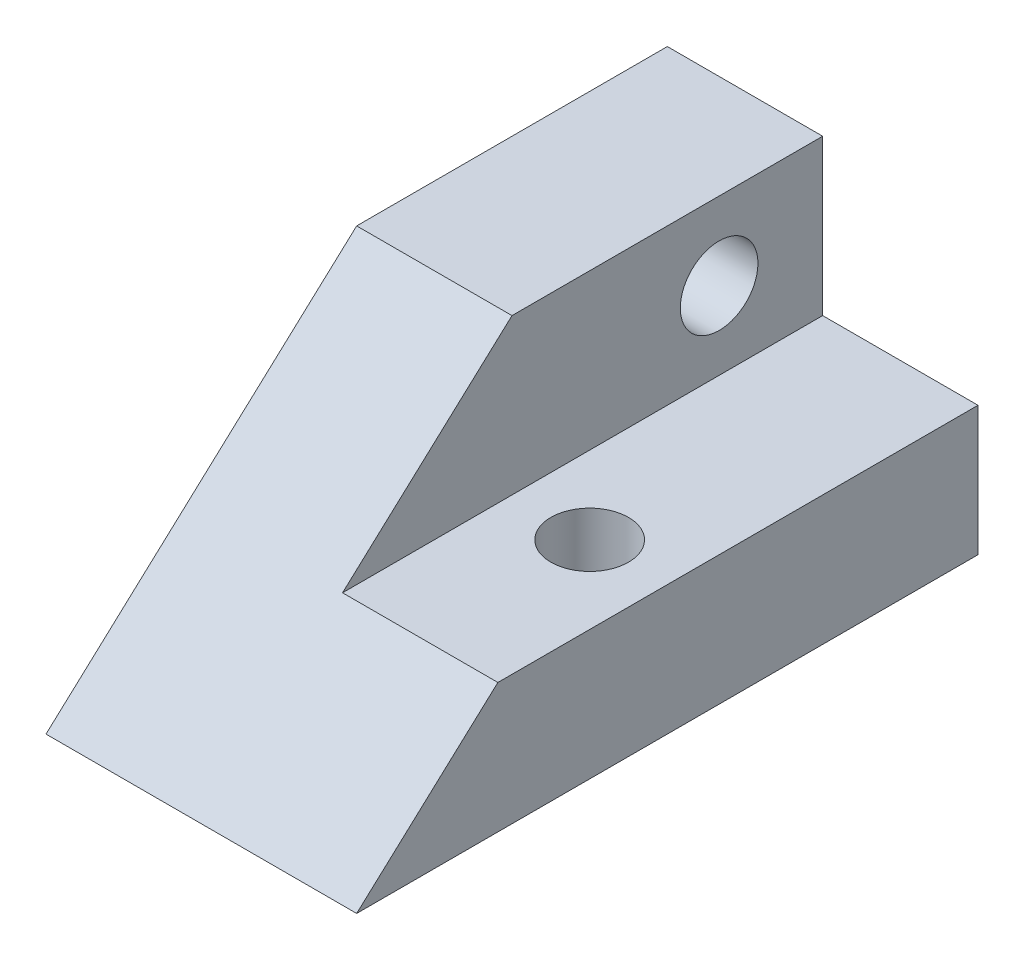
ISO-10303-21;
HEADER;
FILE_DESCRIPTION(('STEP AP214'),'2;1');
FILE_NAME('part.step','',(''),(''),'','','');
FILE_SCHEMA(('AUTOMOTIVE_DESIGN { 1 0 10303 214 1 1 1 1 }'));
ENDSEC;
DATA;
#1=APPLICATION_CONTEXT('core data for automotive mechanical design processes');
#2=APPLICATION_PROTOCOL_DEFINITION('international standard','automotive_design',2000,#1);
#3=PRODUCT_CONTEXT('',#1,'mechanical');
#4=PRODUCT('Part','Part','',(#3));
#5=PRODUCT_RELATED_PRODUCT_CATEGORY('part','',(#4));
#6=PRODUCT_DEFINITION_FORMATION('','',#4);
#7=PRODUCT_DEFINITION_CONTEXT('part definition',#1,'design');
#8=PRODUCT_DEFINITION('design','',#6,#7);
#9=PRODUCT_DEFINITION_SHAPE('','',#8);
#10=(LENGTH_UNIT() NAMED_UNIT(*) SI_UNIT(.MILLI.,.METRE.));
#11=(NAMED_UNIT(*) PLANE_ANGLE_UNIT() SI_UNIT($,.RADIAN.));
#12=(NAMED_UNIT(*) SI_UNIT($,.STERADIAN.) SOLID_ANGLE_UNIT());
#13=UNCERTAINTY_MEASURE_WITH_UNIT(LENGTH_MEASURE(1.E-05),#10,'distance_accuracy_value','');
#14=(GEOMETRIC_REPRESENTATION_CONTEXT(3) GLOBAL_UNCERTAINTY_ASSIGNED_CONTEXT((#13)) GLOBAL_UNIT_ASSIGNED_CONTEXT((#10,
#11,#12)) REPRESENTATION_CONTEXT('',''));
#15=CARTESIAN_POINT('',(0.,0.,0.));
#16=DIRECTION('',(0.,0.,1.));
#17=DIRECTION('',(1.,0.,0.));
#18=AXIS2_PLACEMENT_3D('',#15,#16,#17);
#19=CARTESIAN_POINT('',(-30.,55.,-120.));
#20=DIRECTION('',(0.,0.,1.));
#21=DIRECTION('',(1.,0.,0.));
#22=AXIS2_PLACEMENT_3D('',#19,#20,#21);
#23=PLANE('',#22);
#24=DIRECTION('',(0.,-1.,0.));
#25=VECTOR('',#24,1.);
#26=CARTESIAN_POINT('',(0.,55.,-120.));
#27=LINE('',#26,#25);
#28=CARTESIAN_POINT('',(0.,55.,-120.));
#29=VERTEX_POINT('',#28);
#30=CARTESIAN_POINT('',(0.,25.,-120.));
#31=VERTEX_POINT('',#30);
#32=EDGE_CURVE('E135',#29,#31,#27,.T.);
#33=ORIENTED_EDGE('',*,*,#32,.T.);
#34=DIRECTION('',(-1.,0.,0.));
#35=VECTOR('',#34,1.);
#36=CARTESIAN_POINT('',(30.,25.,-120.));
#37=LINE('',#36,#35);
#38=CARTESIAN_POINT('',(30.,25.,-120.));
#39=VERTEX_POINT('',#38);
#40=EDGE_CURVE('E86',#39,#31,#37,.T.);
#41=ORIENTED_EDGE('',*,*,#40,.F.);
#42=DIRECTION('',(0.,-1.,0.));
#43=VECTOR('',#42,1.);
#44=CARTESIAN_POINT('',(30.,55.,-120.));
#45=LINE('',#44,#43);
#46=CARTESIAN_POINT('',(30.,0.,-120.));
#47=VERTEX_POINT('',#46);
#48=EDGE_CURVE('E79',#39,#47,#45,.T.);
#49=ORIENTED_EDGE('',*,*,#48,.T.);
#50=DIRECTION('',(-1.,0.,0.));
#51=VECTOR('',#50,1.);
#52=CARTESIAN_POINT('',(-30.,0.,-120.));
#53=LINE('',#52,#51);
#54=CARTESIAN_POINT('',(-30.,0.,-120.));
#55=VERTEX_POINT('',#54);
#56=EDGE_CURVE('E83',#47,#55,#53,.T.);
#57=ORIENTED_EDGE('',*,*,#56,.T.);
#58=DIRECTION('',(0.,-1.,0.));
#59=VECTOR('',#58,1.);
#60=CARTESIAN_POINT('',(-30.,55.,-120.));
#61=LINE('',#60,#59);
#62=CARTESIAN_POINT('',(-30.,55.,-120.));
#63=VERTEX_POINT('',#62);
#64=EDGE_CURVE('E90',#63,#55,#61,.T.);
#65=ORIENTED_EDGE('',*,*,#64,.F.);
#66=DIRECTION('',(-1.,0.,0.));
#67=VECTOR('',#66,1.);
#68=CARTESIAN_POINT('',(-30.,55.,-120.));
#69=LINE('',#68,#67);
#70=EDGE_CURVE('E63',#29,#63,#69,.T.);
#71=ORIENTED_EDGE('',*,*,#70,.F.);
#72=EDGE_LOOP('',(#33,#41,#49,#57,#65,#71));
#73=FACE_BOUND('',#72,.T.);
#74=ADVANCED_FACE('F39',(#73),#23,.F.);
#75=CARTESIAN_POINT('',(0.,55.,0.));
#76=DIRECTION('',(0.,1.,0.));
#77=DIRECTION('',(0.,0.,1.));
#78=AXIS2_PLACEMENT_3D('',#75,#76,#77);
#79=PLANE('',#78);
#80=DIRECTION('',(1.,0.,0.));
#81=VECTOR('',#80,1.);
#82=CARTESIAN_POINT('',(-30.,55.,-60.));
#83=LINE('',#82,#81);
#84=CARTESIAN_POINT('',(-30.,55.,-60.));
#85=VERTEX_POINT('',#84);
#86=CARTESIAN_POINT('',(0.,55.,-60.));
#87=VERTEX_POINT('',#86);
#88=EDGE_CURVE('E145',#85,#87,#83,.T.);
#89=ORIENTED_EDGE('',*,*,#88,.T.);
#90=DIRECTION('',(0.,0.,-1.));
#91=VECTOR('',#90,1.);
#92=CARTESIAN_POINT('',(0.,55.,0.));
#93=LINE('',#92,#91);
#94=EDGE_CURVE('E133',#87,#29,#93,.T.);
#95=ORIENTED_EDGE('',*,*,#94,.T.);
#96=ORIENTED_EDGE('',*,*,#70,.T.);
#97=DIRECTION('',(0.,0.,1.));
#98=VECTOR('',#97,1.);
#99=CARTESIAN_POINT('',(-30.,55.,-120.));
#100=LINE('',#99,#98);
#101=EDGE_CURVE('E108',#63,#85,#100,.T.);
#102=ORIENTED_EDGE('',*,*,#101,.T.);
#103=EDGE_LOOP('',(#89,#95,#96,#102));
#104=FACE_BOUND('',#103,.T.);
#105=ADVANCED_FACE('F165',(#104),#79,.T.);
#106=CARTESIAN_POINT('',(-30.,0.,0.));
#107=DIRECTION('',(0.,-0.737154140200741,-0.675724628517346));
#108=DIRECTION('',(0.,0.675724628517346,-0.737154140200741));
#109=AXIS2_PLACEMENT_3D('',#106,#107,#108);
#110=PLANE('',#109);
#111=DIRECTION('',(0.,-0.675724628517346,0.737154140200741));
#112=VECTOR('',#111,1.);
#113=CARTESIAN_POINT('',(0.,0.,0.));
#114=LINE('',#113,#112);
#115=CARTESIAN_POINT('',(0.,25.,-27.2727272727273));
#116=VERTEX_POINT('',#115);
#117=EDGE_CURVE('E11',#87,#116,#114,.T.);
#118=ORIENTED_EDGE('',*,*,#117,.F.);
#119=ORIENTED_EDGE('',*,*,#88,.F.);
#120=DIRECTION('',(0.,0.675724628517346,-0.737154140200741));
#121=VECTOR('',#120,1.);
#122=CARTESIAN_POINT('',(-30.,0.,0.));
#123=LINE('',#122,#121);
#124=CARTESIAN_POINT('',(-30.,0.,0.));
#125=VERTEX_POINT('',#124);
#126=EDGE_CURVE('E141',#125,#85,#123,.T.);
#127=ORIENTED_EDGE('',*,*,#126,.F.);
#128=DIRECTION('',(1.,0.,0.));
#129=VECTOR('',#128,1.);
#130=CARTESIAN_POINT('',(-30.,0.,0.));
#131=LINE('',#130,#129);
#132=CARTESIAN_POINT('',(30.,0.,0.));
#133=VERTEX_POINT('',#132);
#134=EDGE_CURVE('E101',#125,#133,#131,.T.);
#135=ORIENTED_EDGE('',*,*,#134,.T.);
#136=DIRECTION('',(0.,0.675724628517346,-0.737154140200741));
#137=VECTOR('',#136,1.);
#138=CARTESIAN_POINT('',(30.,0.,0.));
#139=LINE('',#138,#137);
#140=CARTESIAN_POINT('',(30.,25.,-27.2727272727273));
#141=VERTEX_POINT('',#140);
#142=EDGE_CURVE('E97',#133,#141,#139,.T.);
#143=ORIENTED_EDGE('',*,*,#142,.T.);
#144=DIRECTION('',(-1.,0.,0.));
#145=VECTOR('',#144,1.);
#146=CARTESIAN_POINT('',(-30.,25.,-27.2727272727273));
#147=LINE('',#146,#145);
#148=EDGE_CURVE('E48',#141,#116,#147,.T.);
#149=ORIENTED_EDGE('',*,*,#148,.T.);
#150=EDGE_LOOP('',(#118,#119,#127,#135,#143,#149));
#151=FACE_BOUND('',#150,.T.);
#152=ADVANCED_FACE('F119',(#151),#110,.F.);
#153=CARTESIAN_POINT('',(-30.,55.,-120.));
#154=DIRECTION('',(1.,0.,0.));
#155=DIRECTION('',(0.,0.,-1.));
#156=AXIS2_PLACEMENT_3D('',#153,#154,#155);
#157=PLANE('',#156);
#158=CARTESIAN_POINT('',(-30.,40.,-100.));
#159=DIRECTION('',(1.,0.,0.));
#160=DIRECTION('',(0.,0.,-1.));
#161=AXIS2_PLACEMENT_3D('',#158,#159,#160);
#162=CIRCLE('',#161,7.50000000000001);
#163=CARTESIAN_POINT('',(-30.,40.,-107.5));
#164=VERTEX_POINT('',#163);
#165=EDGE_CURVE('E197',#164,#164,#162,.T.);
#166=ORIENTED_EDGE('',*,*,#165,.T.);
#167=EDGE_LOOP('',(#166));
#168=FACE_BOUND('',#167,.T.);
#169=DIRECTION('',(0.,0.,1.));
#170=VECTOR('',#169,1.);
#171=CARTESIAN_POINT('',(-30.,0.,-120.));
#172=LINE('',#171,#170);
#173=EDGE_CURVE('E106',#55,#125,#172,.T.);
#174=ORIENTED_EDGE('',*,*,#173,.T.);
#175=ORIENTED_EDGE('',*,*,#126,.T.);
#176=ORIENTED_EDGE('',*,*,#101,.F.);
#177=ORIENTED_EDGE('',*,*,#64,.T.);
#178=EDGE_LOOP('',(#174,#175,#176,#177));
#179=FACE_BOUND('',#178,.T.);
#180=ADVANCED_FACE('F41',(#168,#179),#157,.F.);
#181=CARTESIAN_POINT('',(30.,55.,-120.));
#182=DIRECTION('',(-1.,0.,0.));
#183=DIRECTION('',(0.,0.,1.));
#184=AXIS2_PLACEMENT_3D('',#181,#182,#183);
#185=PLANE('',#184);
#186=ORIENTED_EDGE('',*,*,#48,.F.);
#187=DIRECTION('',(0.,0.,-1.));
#188=VECTOR('',#187,1.);
#189=CARTESIAN_POINT('',(30.,25.,0.));
#190=LINE('',#189,#188);
#191=EDGE_CURVE('E127',#141,#39,#190,.T.);
#192=ORIENTED_EDGE('',*,*,#191,.F.);
#193=ORIENTED_EDGE('',*,*,#142,.F.);
#194=DIRECTION('',(0.,0.,-1.));
#195=VECTOR('',#194,1.);
#196=CARTESIAN_POINT('',(30.,0.,-120.));
#197=LINE('',#196,#195);
#198=EDGE_CURVE('E94',#133,#47,#197,.T.);
#199=ORIENTED_EDGE('',*,*,#198,.T.);
#200=EDGE_LOOP('',(#186,#192,#193,#199));
#201=FACE_BOUND('',#200,.T.);
#202=ADVANCED_FACE('F95',(#201),#185,.F.);
#203=CARTESIAN_POINT('',(0.,0.,0.));
#204=DIRECTION('',(0.,1.,0.));
#205=DIRECTION('',(0.,0.,1.));
#206=AXIS2_PLACEMENT_3D('',#203,#204,#205);
#207=PLANE('',#206);
#208=CARTESIAN_POINT('',(15.,0.,-60.));
#209=DIRECTION('',(0.,1.,0.));
#210=DIRECTION('',(0.,0.,1.));
#211=AXIS2_PLACEMENT_3D('',#208,#209,#210);
#212=CIRCLE('',#211,7.5);
#213=CARTESIAN_POINT('',(15.,0.,-52.5));
#214=VERTEX_POINT('',#213);
#215=EDGE_CURVE('E205',#214,#214,#212,.T.);
#216=ORIENTED_EDGE('',*,*,#215,.T.);
#217=EDGE_LOOP('',(#216));
#218=FACE_BOUND('',#217,.T.);
#219=ORIENTED_EDGE('',*,*,#173,.F.);
#220=ORIENTED_EDGE('',*,*,#56,.F.);
#221=ORIENTED_EDGE('',*,*,#198,.F.);
#222=ORIENTED_EDGE('',*,*,#134,.F.);
#223=EDGE_LOOP('',(#219,#220,#221,#222));
#224=FACE_BOUND('',#223,.T.);
#225=ADVANCED_FACE('F104',(#218,#224),#207,.F.);
#226=CARTESIAN_POINT('',(0.,55.,0.));
#227=DIRECTION('',(1.,0.,0.));
#228=DIRECTION('',(0.,0.,-1.));
#229=AXIS2_PLACEMENT_3D('',#226,#227,#228);
#230=PLANE('',#229);
#231=CARTESIAN_POINT('',(0.,40.,-100.));
#232=DIRECTION('',(1.,0.,0.));
#233=DIRECTION('',(0.,0.,-1.));
#234=AXIS2_PLACEMENT_3D('',#231,#232,#233);
#235=CIRCLE('',#234,7.50000000000001);
#236=CARTESIAN_POINT('',(0.,40.,-107.5));
#237=VERTEX_POINT('',#236);
#238=EDGE_CURVE('E200',#237,#237,#235,.T.);
#239=ORIENTED_EDGE('',*,*,#238,.F.);
#240=EDGE_LOOP('',(#239));
#241=FACE_BOUND('',#240,.T.);
#242=ORIENTED_EDGE('',*,*,#117,.T.);
#243=DIRECTION('',(0.,0.,-1.));
#244=VECTOR('',#243,1.);
#245=CARTESIAN_POINT('',(0.,25.,0.));
#246=LINE('',#245,#244);
#247=EDGE_CURVE('E55',#116,#31,#246,.T.);
#248=ORIENTED_EDGE('',*,*,#247,.T.);
#249=ORIENTED_EDGE('',*,*,#32,.F.);
#250=ORIENTED_EDGE('',*,*,#94,.F.);
#251=EDGE_LOOP('',(#242,#248,#249,#250));
#252=FACE_BOUND('',#251,.T.);
#253=ADVANCED_FACE('F166',(#241,#252),#230,.T.);
#254=CARTESIAN_POINT('',(30.,25.,0.));
#255=DIRECTION('',(0.,-1.,0.));
#256=DIRECTION('',(0.,0.,-1.));
#257=AXIS2_PLACEMENT_3D('',#254,#255,#256);
#258=PLANE('',#257);
#259=CARTESIAN_POINT('',(15.,25.,-60.));
#260=DIRECTION('',(0.,1.,0.));
#261=DIRECTION('',(0.,0.,1.));
#262=AXIS2_PLACEMENT_3D('',#259,#260,#261);
#263=CIRCLE('',#262,7.5);
#264=CARTESIAN_POINT('',(15.,25.,-52.5));
#265=VERTEX_POINT('',#264);
#266=EDGE_CURVE('E208',#265,#265,#263,.T.);
#267=ORIENTED_EDGE('',*,*,#266,.F.);
#268=EDGE_LOOP('',(#267));
#269=FACE_BOUND('',#268,.T.);
#270=ORIENTED_EDGE('',*,*,#191,.T.);
#271=ORIENTED_EDGE('',*,*,#40,.T.);
#272=ORIENTED_EDGE('',*,*,#247,.F.);
#273=ORIENTED_EDGE('',*,*,#148,.F.);
#274=EDGE_LOOP('',(#270,#271,#272,#273));
#275=FACE_BOUND('',#274,.T.);
#276=ADVANCED_FACE('F126',(#269,#275),#258,.F.);
#277=CARTESIAN_POINT('',(-30.,40.,-100.));
#278=DIRECTION('',(1.,0.,0.));
#279=DIRECTION('',(0.,0.,-1.));
#280=AXIS2_PLACEMENT_3D('',#277,#278,#279);
#281=CYLINDRICAL_SURFACE('',#280,7.50000000000001);
#282=ORIENTED_EDGE('',*,*,#165,.F.);
#283=EDGE_LOOP('',(#282));
#284=FACE_BOUND('',#283,.T.);
#285=ORIENTED_EDGE('',*,*,#238,.T.);
#286=EDGE_LOOP('',(#285));
#287=FACE_BOUND('',#286,.T.);
#288=ADVANCED_FACE('F174',(#284,#287),#281,.F.);
#289=CARTESIAN_POINT('',(15.,0.,-60.));
#290=DIRECTION('',(0.,1.,0.));
#291=DIRECTION('',(0.,0.,1.));
#292=AXIS2_PLACEMENT_3D('',#289,#290,#291);
#293=CYLINDRICAL_SURFACE('',#292,7.5);
#294=ORIENTED_EDGE('',*,*,#215,.F.);
#295=EDGE_LOOP('',(#294));
#296=FACE_BOUND('',#295,.T.);
#297=ORIENTED_EDGE('',*,*,#266,.T.);
#298=EDGE_LOOP('',(#297));
#299=FACE_BOUND('',#298,.T.);
#300=ADVANCED_FACE('F216',(#296,#299),#293,.F.);
#301=CLOSED_SHELL('',(#74,#105,#152,#180,#202,#225,#253,#276,#288,#300));
#302=MANIFOLD_SOLID_BREP('B2',#301);
#303=ADVANCED_BREP_SHAPE_REPRESENTATION('',(#18,#302),#14);
#304=SHAPE_DEFINITION_REPRESENTATION(#9,#303);
ENDSEC;
END-ISO-10303-21;
